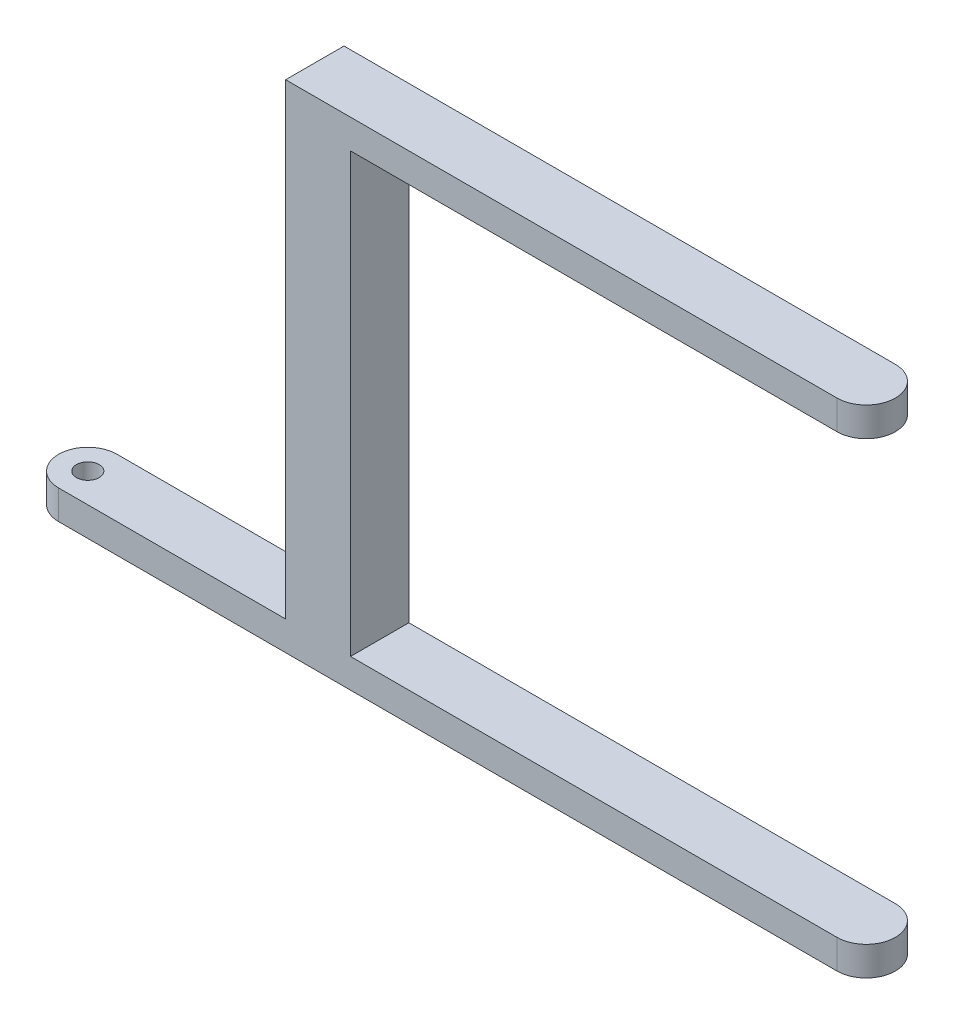
ISO-10303-21;
HEADER;
FILE_DESCRIPTION(('STEP AP214'),'2;1');
FILE_NAME('part.step','',(''),(''),'','','');
FILE_SCHEMA(('AUTOMOTIVE_DESIGN { 1 0 10303 214 1 1 1 1 }'));
ENDSEC;
DATA;
#1=APPLICATION_CONTEXT('core data for automotive mechanical design processes');
#2=APPLICATION_PROTOCOL_DEFINITION('international standard','automotive_design',2000,#1);
#3=PRODUCT_CONTEXT('',#1,'mechanical');
#4=PRODUCT('Part','Part','',(#3));
#5=PRODUCT_RELATED_PRODUCT_CATEGORY('part','',(#4));
#6=PRODUCT_DEFINITION_FORMATION('','',#4);
#7=PRODUCT_DEFINITION_CONTEXT('part definition',#1,'design');
#8=PRODUCT_DEFINITION('design','',#6,#7);
#9=PRODUCT_DEFINITION_SHAPE('','',#8);
#10=(LENGTH_UNIT() NAMED_UNIT(*) SI_UNIT(.MILLI.,.METRE.));
#11=(NAMED_UNIT(*) PLANE_ANGLE_UNIT() SI_UNIT($,.RADIAN.));
#12=(NAMED_UNIT(*) SI_UNIT($,.STERADIAN.) SOLID_ANGLE_UNIT());
#13=UNCERTAINTY_MEASURE_WITH_UNIT(LENGTH_MEASURE(1.E-05),#10,'distance_accuracy_value','');
#14=(GEOMETRIC_REPRESENTATION_CONTEXT(3) GLOBAL_UNCERTAINTY_ASSIGNED_CONTEXT((#13)) GLOBAL_UNIT_ASSIGNED_CONTEXT((#10,
#11,#12)) REPRESENTATION_CONTEXT('',''));
#15=CARTESIAN_POINT('',(0.,0.,0.));
#16=DIRECTION('',(0.,0.,1.));
#17=DIRECTION('',(1.,0.,0.));
#18=AXIS2_PLACEMENT_3D('',#15,#16,#17);
#19=CARTESIAN_POINT('',(0.,4.5,0.));
#20=DIRECTION('',(0.,1.,0.));
#21=DIRECTION('',(0.,0.,1.));
#22=AXIS2_PLACEMENT_3D('',#19,#20,#21);
#23=PLANE('',#22);
#24=DIRECTION('',(0.,0.,1.));
#25=VECTOR('',#24,1.);
#26=CARTESIAN_POINT('',(35.,4.5,-4.5));
#27=LINE('',#26,#25);
#28=CARTESIAN_POINT('',(35.,4.5,-4.5));
#29=VERTEX_POINT('',#28);
#30=CARTESIAN_POINT('',(35.,4.5,4.5));
#31=VERTEX_POINT('',#30);
#32=EDGE_CURVE('E55',#29,#31,#27,.T.);
#33=ORIENTED_EDGE('',*,*,#32,.F.);
#34=DIRECTION('',(-1.,0.,0.));
#35=VECTOR('',#34,1.);
#36=CARTESIAN_POINT('',(0.,4.5,-4.5));
#37=LINE('',#36,#35);
#38=CARTESIAN_POINT('',(0.,4.5,-4.5));
#39=VERTEX_POINT('',#38);
#40=EDGE_CURVE('E178',#29,#39,#37,.T.);
#41=ORIENTED_EDGE('',*,*,#40,.T.);
#42=CARTESIAN_POINT('',(0.,4.5,0.));
#43=DIRECTION('',(0.,1.,0.));
#44=DIRECTION('',(0.,0.,1.));
#45=AXIS2_PLACEMENT_3D('',#42,#43,#44);
#46=CIRCLE('',#45,4.5);
#47=CARTESIAN_POINT('',(0.,4.5,4.5));
#48=VERTEX_POINT('',#47);
#49=EDGE_CURVE('E169',#39,#48,#46,.T.);
#50=ORIENTED_EDGE('',*,*,#49,.T.);
#51=DIRECTION('',(1.,0.,0.));
#52=VECTOR('',#51,1.);
#53=CARTESIAN_POINT('',(0.,4.5,4.5));
#54=LINE('',#53,#52);
#55=EDGE_CURVE('E174',#48,#31,#54,.T.);
#56=ORIENTED_EDGE('',*,*,#55,.T.);
#57=EDGE_LOOP('',(#33,#41,#50,#56));
#58=FACE_BOUND('',#57,.T.);
#59=CARTESIAN_POINT('',(0.,4.5,0.));
#60=DIRECTION('',(0.,1.,0.));
#61=DIRECTION('',(0.,0.,1.));
#62=AXIS2_PLACEMENT_3D('',#59,#60,#61);
#63=CIRCLE('',#62,1.75);
#64=CARTESIAN_POINT('',(0.,4.5,1.75));
#65=VERTEX_POINT('',#64);
#66=EDGE_CURVE('E166',#65,#65,#63,.T.);
#67=ORIENTED_EDGE('',*,*,#66,.F.);
#68=EDGE_LOOP('',(#67));
#69=FACE_BOUND('',#68,.T.);
#70=ADVANCED_FACE('F39',(#58,#69),#23,.T.);
#71=CARTESIAN_POINT('',(0.,4.5,0.));
#72=DIRECTION('',(0.,-1.,0.));
#73=DIRECTION('',(0.,0.,-1.));
#74=AXIS2_PLACEMENT_3D('',#71,#72,#73);
#75=CYLINDRICAL_SURFACE('',#74,4.5);
#76=CARTESIAN_POINT('',(0.,0.,0.));
#77=DIRECTION('',(0.,1.,0.));
#78=DIRECTION('',(0.,0.,1.));
#79=AXIS2_PLACEMENT_3D('',#76,#77,#78);
#80=CIRCLE('',#79,4.5);
#81=CARTESIAN_POINT('',(0.,0.,-4.5));
#82=VERTEX_POINT('',#81);
#83=CARTESIAN_POINT('',(0.,0.,4.5));
#84=VERTEX_POINT('',#83);
#85=EDGE_CURVE('E182',#82,#84,#80,.T.);
#86=ORIENTED_EDGE('',*,*,#85,.T.);
#87=DIRECTION('',(0.,-1.,0.));
#88=VECTOR('',#87,1.);
#89=CARTESIAN_POINT('',(0.,4.5,4.5));
#90=LINE('',#89,#88);
#91=EDGE_CURVE('E11',#48,#84,#90,.T.);
#92=ORIENTED_EDGE('',*,*,#91,.F.);
#93=ORIENTED_EDGE('',*,*,#49,.F.);
#94=DIRECTION('',(0.,-1.,0.));
#95=VECTOR('',#94,1.);
#96=CARTESIAN_POINT('',(0.,4.5,-4.5));
#97=LINE('',#96,#95);
#98=EDGE_CURVE('E181',#39,#82,#97,.T.);
#99=ORIENTED_EDGE('',*,*,#98,.T.);
#100=EDGE_LOOP('',(#86,#92,#93,#99));
#101=FACE_BOUND('',#100,.T.);
#102=ADVANCED_FACE('F41',(#101),#75,.T.);
#103=CARTESIAN_POINT('',(0.,4.5,4.5));
#104=DIRECTION('',(0.,0.,-1.));
#105=DIRECTION('',(-1.,0.,0.));
#106=AXIS2_PLACEMENT_3D('',#103,#104,#105);
#107=PLANE('',#106);
#108=DIRECTION('',(1.,0.,0.));
#109=VECTOR('',#108,1.);
#110=CARTESIAN_POINT('',(0.,0.,4.5));
#111=LINE('',#110,#109);
#112=CARTESIAN_POINT('',(120.,0.,4.5));
#113=VERTEX_POINT('',#112);
#114=EDGE_CURVE('E185',#84,#113,#111,.T.);
#115=ORIENTED_EDGE('',*,*,#114,.T.);
#116=DIRECTION('',(0.,-1.,0.));
#117=VECTOR('',#116,1.);
#118=CARTESIAN_POINT('',(120.,4.5,4.5));
#119=LINE('',#118,#117);
#120=CARTESIAN_POINT('',(120.,4.5,4.5));
#121=VERTEX_POINT('',#120);
#122=EDGE_CURVE('E48',#121,#113,#119,.T.);
#123=ORIENTED_EDGE('',*,*,#122,.F.);
#124=CARTESIAN_POINT('',(45.,4.5,4.5));
#125=VERTEX_POINT('',#124);
#126=EDGE_CURVE('E172',#125,#121,#54,.T.);
#127=ORIENTED_EDGE('',*,*,#126,.F.);
#128=DIRECTION('',(0.,-1.,0.));
#129=VECTOR('',#128,1.);
#130=CARTESIAN_POINT('',(45.,72.,4.5));
#131=LINE('',#130,#129);
#132=CARTESIAN_POINT('',(45.,72.,4.5));
#133=VERTEX_POINT('',#132);
#134=EDGE_CURVE('E140',#133,#125,#131,.T.);
#135=ORIENTED_EDGE('',*,*,#134,.F.);
#136=DIRECTION('',(1.,0.,0.));
#137=VECTOR('',#136,1.);
#138=CARTESIAN_POINT('',(35.,72.,4.5));
#139=LINE('',#138,#137);
#140=CARTESIAN_POINT('',(120.,72.,4.5));
#141=VERTEX_POINT('',#140);
#142=EDGE_CURVE('E133',#133,#141,#139,.T.);
#143=ORIENTED_EDGE('',*,*,#142,.T.);
#144=DIRECTION('',(0.,-1.,0.));
#145=VECTOR('',#144,1.);
#146=CARTESIAN_POINT('',(120.,76.5,4.5));
#147=LINE('',#146,#145);
#148=CARTESIAN_POINT('',(120.,76.5,4.5));
#149=VERTEX_POINT('',#148);
#150=EDGE_CURVE('E116',#149,#141,#147,.T.);
#151=ORIENTED_EDGE('',*,*,#150,.F.);
#152=DIRECTION('',(1.,0.,0.));
#153=VECTOR('',#152,1.);
#154=CARTESIAN_POINT('',(35.,76.5,4.5));
#155=LINE('',#154,#153);
#156=CARTESIAN_POINT('',(35.,76.5,4.5));
#157=VERTEX_POINT('',#156);
#158=EDGE_CURVE('E145',#157,#149,#155,.T.);
#159=ORIENTED_EDGE('',*,*,#158,.F.);
#160=DIRECTION('',(0.,-1.,0.));
#161=VECTOR('',#160,1.);
#162=CARTESIAN_POINT('',(35.,72.,4.5));
#163=LINE('',#162,#161);
#164=EDGE_CURVE('E163',#157,#31,#163,.T.);
#165=ORIENTED_EDGE('',*,*,#164,.T.);
#166=ORIENTED_EDGE('',*,*,#55,.F.);
#167=ORIENTED_EDGE('',*,*,#91,.T.);
#168=EDGE_LOOP('',(#115,#123,#127,#135,#143,#151,#159,#165,#166,#167));
#169=FACE_BOUND('',#168,.T.);
#170=ADVANCED_FACE('F138',(#169),#107,.F.);
#171=CARTESIAN_POINT('',(120.,4.5,0.));
#172=DIRECTION('',(0.,-1.,0.));
#173=DIRECTION('',(0.,0.,-1.));
#174=AXIS2_PLACEMENT_3D('',#171,#172,#173);
#175=CYLINDRICAL_SURFACE('',#174,4.5);
#176=CARTESIAN_POINT('',(120.,0.,0.));
#177=DIRECTION('',(0.,1.,0.));
#178=DIRECTION('',(0.,0.,1.));
#179=AXIS2_PLACEMENT_3D('',#176,#177,#178);
#180=CIRCLE('',#179,4.5);
#181=CARTESIAN_POINT('',(120.,0.,-4.5));
#182=VERTEX_POINT('',#181);
#183=EDGE_CURVE('E187',#113,#182,#180,.T.);
#184=ORIENTED_EDGE('',*,*,#183,.T.);
#185=DIRECTION('',(0.,-1.,0.));
#186=VECTOR('',#185,1.);
#187=CARTESIAN_POINT('',(120.,4.5,-4.5));
#188=LINE('',#187,#186);
#189=CARTESIAN_POINT('',(120.,4.5,-4.5));
#190=VERTEX_POINT('',#189);
#191=EDGE_CURVE('E192',#190,#182,#188,.T.);
#192=ORIENTED_EDGE('',*,*,#191,.F.);
#193=CARTESIAN_POINT('',(120.,4.5,0.));
#194=DIRECTION('',(0.,1.,0.));
#195=DIRECTION('',(0.,0.,1.));
#196=AXIS2_PLACEMENT_3D('',#193,#194,#195);
#197=CIRCLE('',#196,4.5);
#198=EDGE_CURVE('E176',#121,#190,#197,.T.);
#199=ORIENTED_EDGE('',*,*,#198,.F.);
#200=ORIENTED_EDGE('',*,*,#122,.T.);
#201=EDGE_LOOP('',(#184,#192,#199,#200));
#202=FACE_BOUND('',#201,.T.);
#203=ADVANCED_FACE('F200',(#202),#175,.T.);
#204=CARTESIAN_POINT('',(0.,4.5,-4.5));
#205=DIRECTION('',(0.,0.,1.));
#206=DIRECTION('',(1.,0.,0.));
#207=AXIS2_PLACEMENT_3D('',#204,#205,#206);
#208=PLANE('',#207);
#209=DIRECTION('',(-1.,0.,0.));
#210=VECTOR('',#209,1.);
#211=CARTESIAN_POINT('',(0.,0.,-4.5));
#212=LINE('',#211,#210);
#213=EDGE_CURVE('E173',#182,#82,#212,.T.);
#214=ORIENTED_EDGE('',*,*,#213,.T.);
#215=ORIENTED_EDGE('',*,*,#98,.F.);
#216=ORIENTED_EDGE('',*,*,#40,.F.);
#217=DIRECTION('',(0.,-1.,0.));
#218=VECTOR('',#217,1.);
#219=CARTESIAN_POINT('',(35.,72.,-4.5));
#220=LINE('',#219,#218);
#221=CARTESIAN_POINT('',(35.,76.5,-4.5));
#222=VERTEX_POINT('',#221);
#223=EDGE_CURVE('E154',#222,#29,#220,.T.);
#224=ORIENTED_EDGE('',*,*,#223,.F.);
#225=DIRECTION('',(1.,0.,0.));
#226=VECTOR('',#225,1.);
#227=CARTESIAN_POINT('',(35.,76.5,-4.5));
#228=LINE('',#227,#226);
#229=CARTESIAN_POINT('',(120.,76.5,-4.5));
#230=VERTEX_POINT('',#229);
#231=EDGE_CURVE('E142',#222,#230,#228,.T.);
#232=ORIENTED_EDGE('',*,*,#231,.T.);
#233=DIRECTION('',(0.,-1.,0.));
#234=VECTOR('',#233,1.);
#235=CARTESIAN_POINT('',(120.,76.5,-4.5));
#236=LINE('',#235,#234);
#237=CARTESIAN_POINT('',(120.,72.,-4.5));
#238=VERTEX_POINT('',#237);
#239=EDGE_CURVE('E127',#230,#238,#236,.T.);
#240=ORIENTED_EDGE('',*,*,#239,.T.);
#241=DIRECTION('',(1.,0.,0.));
#242=VECTOR('',#241,1.);
#243=CARTESIAN_POINT('',(35.,72.,-4.5));
#244=LINE('',#243,#242);
#245=CARTESIAN_POINT('',(45.,72.,-4.5));
#246=VERTEX_POINT('',#245);
#247=EDGE_CURVE('E135',#246,#238,#244,.T.);
#248=ORIENTED_EDGE('',*,*,#247,.F.);
#249=DIRECTION('',(0.,-1.,0.));
#250=VECTOR('',#249,1.);
#251=CARTESIAN_POINT('',(45.,72.,-4.5));
#252=LINE('',#251,#250);
#253=CARTESIAN_POINT('',(45.,4.5,-4.5));
#254=VERTEX_POINT('',#253);
#255=EDGE_CURVE('E159',#246,#254,#252,.T.);
#256=ORIENTED_EDGE('',*,*,#255,.T.);
#257=EDGE_CURVE('E179',#190,#254,#37,.T.);
#258=ORIENTED_EDGE('',*,*,#257,.F.);
#259=ORIENTED_EDGE('',*,*,#191,.T.);
#260=EDGE_LOOP('',(#214,#215,#216,#224,#232,#240,#248,#256,#258,#259));
#261=FACE_BOUND('',#260,.T.);
#262=ADVANCED_FACE('F208',(#261),#208,.F.);
#263=DIRECTION('',(0.,0.,-1.));
#264=VECTOR('',#263,1.);
#265=CARTESIAN_POINT('',(45.,4.5,-4.5));
#266=LINE('',#265,#264);
#267=EDGE_CURVE('E63',#125,#254,#266,.T.);
#268=ORIENTED_EDGE('',*,*,#267,.F.);
#269=ORIENTED_EDGE('',*,*,#126,.T.);
#270=ORIENTED_EDGE('',*,*,#198,.T.);
#271=ORIENTED_EDGE('',*,*,#257,.T.);
#272=EDGE_LOOP('',(#268,#269,#270,#271));
#273=FACE_BOUND('',#272,.T.);
#274=ADVANCED_FACE('F236',(#273),#23,.T.);
#275=CARTESIAN_POINT('',(0.,0.,0.));
#276=DIRECTION('',(0.,1.,0.));
#277=DIRECTION('',(0.,0.,1.));
#278=AXIS2_PLACEMENT_3D('',#275,#276,#277);
#279=PLANE('',#278);
#280=CARTESIAN_POINT('',(0.,0.,0.));
#281=DIRECTION('',(0.,1.,0.));
#282=DIRECTION('',(0.,0.,1.));
#283=AXIS2_PLACEMENT_3D('',#280,#281,#282);
#284=CIRCLE('',#283,1.75);
#285=CARTESIAN_POINT('',(0.,0.,1.75));
#286=VERTEX_POINT('',#285);
#287=EDGE_CURVE('E43',#286,#286,#284,.T.);
#288=ORIENTED_EDGE('',*,*,#287,.T.);
#289=EDGE_LOOP('',(#288));
#290=FACE_BOUND('',#289,.T.);
#291=ORIENTED_EDGE('',*,*,#85,.F.);
#292=ORIENTED_EDGE('',*,*,#213,.F.);
#293=ORIENTED_EDGE('',*,*,#183,.F.);
#294=ORIENTED_EDGE('',*,*,#114,.F.);
#295=EDGE_LOOP('',(#291,#292,#293,#294));
#296=FACE_BOUND('',#295,.T.);
#297=ADVANCED_FACE('F205',(#290,#296),#279,.F.);
#298=CARTESIAN_POINT('',(0.,-5.5,0.));
#299=DIRECTION('',(0.,1.,0.));
#300=DIRECTION('',(0.,0.,1.));
#301=AXIS2_PLACEMENT_3D('',#298,#299,#300);
#302=CYLINDRICAL_SURFACE('',#301,1.75);
#303=ORIENTED_EDGE('',*,*,#66,.T.);
#304=EDGE_LOOP('',(#303));
#305=FACE_BOUND('',#304,.T.);
#306=ORIENTED_EDGE('',*,*,#287,.F.);
#307=EDGE_LOOP('',(#306));
#308=FACE_BOUND('',#307,.T.);
#309=ADVANCED_FACE('F232',(#305,#308),#302,.F.);
#310=CARTESIAN_POINT('',(35.,72.,-4.5));
#311=DIRECTION('',(1.,0.,0.));
#312=DIRECTION('',(0.,0.,-1.));
#313=AXIS2_PLACEMENT_3D('',#310,#311,#312);
#314=PLANE('',#313);
#315=ORIENTED_EDGE('',*,*,#32,.T.);
#316=ORIENTED_EDGE('',*,*,#164,.F.);
#317=DIRECTION('',(0.,0.,-1.));
#318=VECTOR('',#317,1.);
#319=CARTESIAN_POINT('',(35.,76.5,4.5));
#320=LINE('',#319,#318);
#321=EDGE_CURVE('E151',#157,#222,#320,.T.);
#322=ORIENTED_EDGE('',*,*,#321,.T.);
#323=ORIENTED_EDGE('',*,*,#223,.T.);
#324=EDGE_LOOP('',(#315,#316,#322,#323));
#325=FACE_BOUND('',#324,.T.);
#326=ADVANCED_FACE('F217',(#325),#314,.F.);
#327=CARTESIAN_POINT('',(45.,72.,-4.5));
#328=DIRECTION('',(-1.,0.,0.));
#329=DIRECTION('',(0.,0.,1.));
#330=AXIS2_PLACEMENT_3D('',#327,#328,#329);
#331=PLANE('',#330);
#332=ORIENTED_EDGE('',*,*,#267,.T.);
#333=ORIENTED_EDGE('',*,*,#255,.F.);
#334=DIRECTION('',(0.,0.,-1.));
#335=VECTOR('',#334,1.);
#336=CARTESIAN_POINT('',(45.,72.,-4.5));
#337=LINE('',#336,#335);
#338=EDGE_CURVE('E152',#133,#246,#337,.T.);
#339=ORIENTED_EDGE('',*,*,#338,.F.);
#340=ORIENTED_EDGE('',*,*,#134,.T.);
#341=EDGE_LOOP('',(#332,#333,#339,#340));
#342=FACE_BOUND('',#341,.T.);
#343=ADVANCED_FACE('F224',(#342),#331,.F.);
#344=CARTESIAN_POINT('',(0.,72.,0.));
#345=DIRECTION('',(0.,1.,0.));
#346=DIRECTION('',(0.,0.,1.));
#347=AXIS2_PLACEMENT_3D('',#344,#345,#346);
#348=PLANE('',#347);
#349=ORIENTED_EDGE('',*,*,#247,.T.);
#350=CARTESIAN_POINT('',(120.,72.,0.));
#351=DIRECTION('',(0.,1.,0.));
#352=DIRECTION('',(0.,0.,1.));
#353=AXIS2_PLACEMENT_3D('',#350,#351,#352);
#354=CIRCLE('',#353,4.5);
#355=EDGE_CURVE('E120',#141,#238,#354,.T.);
#356=ORIENTED_EDGE('',*,*,#355,.F.);
#357=ORIENTED_EDGE('',*,*,#142,.F.);
#358=ORIENTED_EDGE('',*,*,#338,.T.);
#359=EDGE_LOOP('',(#349,#356,#357,#358));
#360=FACE_BOUND('',#359,.T.);
#361=ADVANCED_FACE('F131',(#360),#348,.F.);
#362=CARTESIAN_POINT('',(0.,76.5,0.));
#363=DIRECTION('',(0.,1.,0.));
#364=DIRECTION('',(0.,0.,1.));
#365=AXIS2_PLACEMENT_3D('',#362,#363,#364);
#366=PLANE('',#365);
#367=ORIENTED_EDGE('',*,*,#158,.T.);
#368=CARTESIAN_POINT('',(120.,76.5,0.));
#369=DIRECTION('',(0.,1.,0.));
#370=DIRECTION('',(0.,0.,1.));
#371=AXIS2_PLACEMENT_3D('',#368,#369,#370);
#372=CIRCLE('',#371,4.5);
#373=EDGE_CURVE('E122',#149,#230,#372,.T.);
#374=ORIENTED_EDGE('',*,*,#373,.T.);
#375=ORIENTED_EDGE('',*,*,#231,.F.);
#376=ORIENTED_EDGE('',*,*,#321,.F.);
#377=EDGE_LOOP('',(#367,#374,#375,#376));
#378=FACE_BOUND('',#377,.T.);
#379=ADVANCED_FACE('F222',(#378),#366,.T.);
#380=CARTESIAN_POINT('',(120.,72.,0.));
#381=DIRECTION('',(0.,1.,0.));
#382=DIRECTION('',(0.,0.,1.));
#383=AXIS2_PLACEMENT_3D('',#380,#381,#382);
#384=CYLINDRICAL_SURFACE('',#383,4.5);
#385=ORIENTED_EDGE('',*,*,#150,.T.);
#386=ORIENTED_EDGE('',*,*,#355,.T.);
#387=ORIENTED_EDGE('',*,*,#239,.F.);
#388=ORIENTED_EDGE('',*,*,#373,.F.);
#389=EDGE_LOOP('',(#385,#386,#387,#388));
#390=FACE_BOUND('',#389,.T.);
#391=ADVANCED_FACE('F118',(#390),#384,.T.);
#392=CLOSED_SHELL('',(#70,#102,#170,#203,#262,#274,#297,#309,#326,#343,#361,#379,#391));
#393=MANIFOLD_SOLID_BREP('B2',#392);
#394=ADVANCED_BREP_SHAPE_REPRESENTATION('',(#18,#393),#14);
#395=SHAPE_DEFINITION_REPRESENTATION(#9,#394);
ENDSEC;
END-ISO-10303-21;
